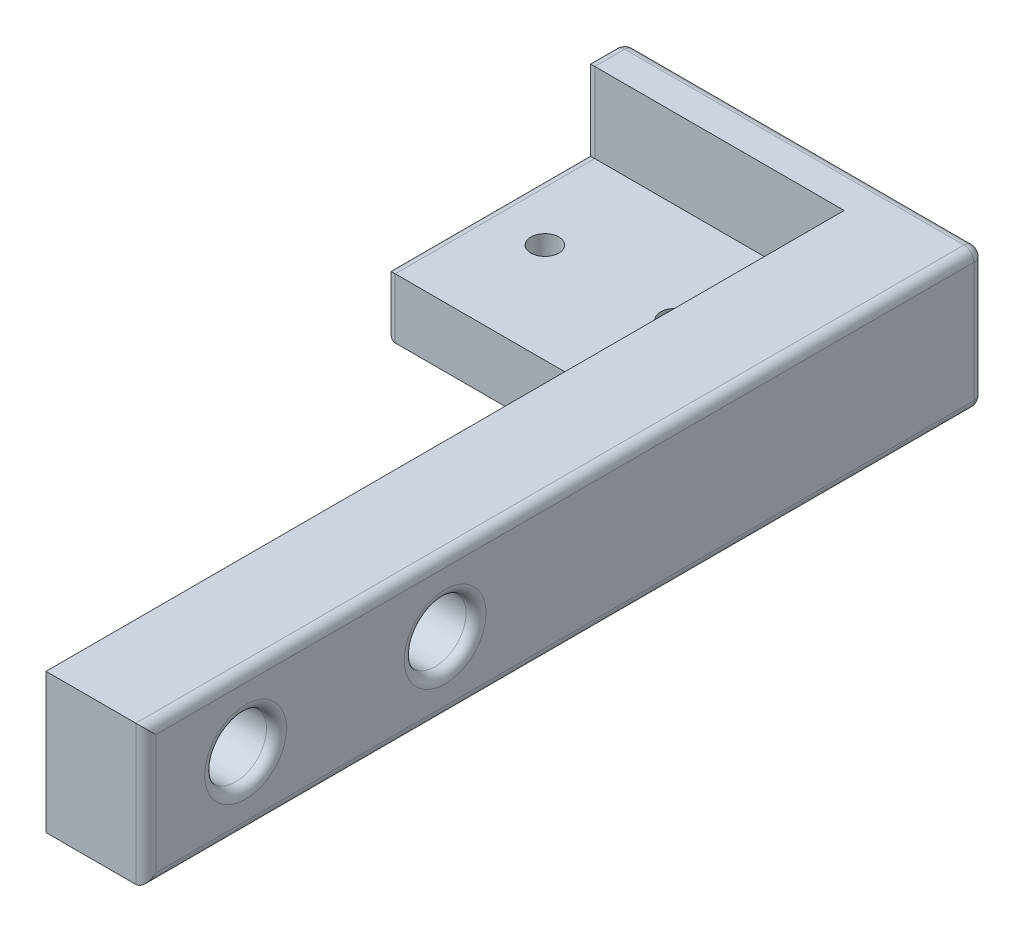
ISO-10303-21;
HEADER;
FILE_DESCRIPTION(('STEP AP214'),'2;1');
FILE_NAME('part.step','',(''),(''),'','','');
FILE_SCHEMA(('AUTOMOTIVE_DESIGN { 1 0 10303 214 1 1 1 1 }'));
ENDSEC;
DATA;
#1=APPLICATION_CONTEXT('core data for automotive mechanical design processes');
#2=APPLICATION_PROTOCOL_DEFINITION('international standard','automotive_design',2000,#1);
#3=PRODUCT_CONTEXT('',#1,'mechanical');
#4=PRODUCT('Part','Part','',(#3));
#5=PRODUCT_RELATED_PRODUCT_CATEGORY('part','',(#4));
#6=PRODUCT_DEFINITION_FORMATION('','',#4);
#7=PRODUCT_DEFINITION_CONTEXT('part definition',#1,'design');
#8=PRODUCT_DEFINITION('design','',#6,#7);
#9=PRODUCT_DEFINITION_SHAPE('','',#8);
#10=(LENGTH_UNIT() NAMED_UNIT(*) SI_UNIT(.MILLI.,.METRE.));
#11=(NAMED_UNIT(*) PLANE_ANGLE_UNIT() SI_UNIT($,.RADIAN.));
#12=(NAMED_UNIT(*) SI_UNIT($,.STERADIAN.) SOLID_ANGLE_UNIT());
#13=UNCERTAINTY_MEASURE_WITH_UNIT(LENGTH_MEASURE(1.E-05),#10,'distance_accuracy_value','');
#14=(GEOMETRIC_REPRESENTATION_CONTEXT(3) GLOBAL_UNCERTAINTY_ASSIGNED_CONTEXT((#13)) GLOBAL_UNIT_ASSIGNED_CONTEXT((#10,
#11,#12)) REPRESENTATION_CONTEXT('',''));
#15=CARTESIAN_POINT('',(0.,0.,0.));
#16=DIRECTION('',(0.,0.,1.));
#17=DIRECTION('',(1.,0.,0.));
#18=AXIS2_PLACEMENT_3D('',#15,#16,#17);
#19=CARTESIAN_POINT('',(0.,7.,0.));
#20=DIRECTION('',(0.,1.,0.));
#21=DIRECTION('',(0.,0.,1.));
#22=AXIS2_PLACEMENT_3D('',#19,#20,#21);
#23=PLANE('',#22);
#24=DIRECTION('',(1.,0.,0.));
#25=VECTOR('',#24,1.);
#26=CARTESIAN_POINT('',(0.,7.,-26.5));
#27=LINE('',#26,#25);
#28=CARTESIAN_POINT('',(2.,7.,-26.5));
#29=VERTEX_POINT('',#28);
#30=CARTESIAN_POINT('',(-15.,7.,-26.5));
#31=VERTEX_POINT('',#30);
#32=EDGE_CURVE('E259',#29,#31,#27,.F.);
#33=ORIENTED_EDGE('',*,*,#32,.T.);
#34=DIRECTION('',(0.,0.,-1.));
#35=VECTOR('',#34,1.);
#36=CARTESIAN_POINT('',(-15.,7.,-25.));
#37=LINE('',#36,#35);
#38=CARTESIAN_POINT('',(-15.,7.,-25.));
#39=VERTEX_POINT('',#38);
#40=EDGE_CURVE('E11',#31,#39,#37,.F.);
#41=ORIENTED_EDGE('',*,*,#40,.T.);
#42=DIRECTION('',(-1.,0.,0.));
#43=VECTOR('',#42,1.);
#44=CARTESIAN_POINT('',(-15.5,7.,-25.));
#45=LINE('',#44,#43);
#46=CARTESIAN_POINT('',(-2.5,7.,-25.));
#47=VERTEX_POINT('',#46);
#48=EDGE_CURVE('E170',#47,#39,#45,.T.);
#49=ORIENTED_EDGE('',*,*,#48,.F.);
#50=DIRECTION('',(0.,0.,1.));
#51=VECTOR('',#50,1.);
#52=CARTESIAN_POINT('',(-2.5,7.,-15.));
#53=LINE('',#52,#51);
#54=CARTESIAN_POINT('',(-2.5,7.,15.));
#55=VERTEX_POINT('',#54);
#56=EDGE_CURVE('E150',#47,#55,#53,.T.);
#57=ORIENTED_EDGE('',*,*,#56,.T.);
#58=DIRECTION('',(1.,0.,0.));
#59=VECTOR('',#58,1.);
#60=CARTESIAN_POINT('',(-2.5,7.,15.));
#61=LINE('',#60,#59);
#62=CARTESIAN_POINT('',(2.,7.,15.));
#63=VERTEX_POINT('',#62);
#64=EDGE_CURVE('E163',#55,#63,#61,.T.);
#65=ORIENTED_EDGE('',*,*,#64,.T.);
#66=DIRECTION('',(0.,0.,-1.));
#67=VECTOR('',#66,1.);
#68=CARTESIAN_POINT('',(2.,7.,-27.));
#69=LINE('',#68,#67);
#70=EDGE_CURVE('E262',#63,#29,#69,.T.);
#71=ORIENTED_EDGE('',*,*,#70,.T.);
#72=EDGE_LOOP('',(#33,#41,#49,#57,#65,#71));
#73=FACE_BOUND('',#72,.T.);
#74=ADVANCED_FACE('F41',(#73),#23,.T.);
#75=CARTESIAN_POINT('',(0.,0.,0.));
#76=DIRECTION('',(0.,1.,0.));
#77=DIRECTION('',(0.,0.,1.));
#78=AXIS2_PLACEMENT_3D('',#75,#76,#77);
#79=PLANE('',#78);
#80=DIRECTION('',(1.,0.,0.));
#81=VECTOR('',#80,1.);
#82=CARTESIAN_POINT('',(-2.5,0.,-15.));
#83=LINE('',#82,#81);
#84=CARTESIAN_POINT('',(-15.,0.,-15.));
#85=VERTEX_POINT('',#84);
#86=CARTESIAN_POINT('',(-2.5,0.,-15.));
#87=VERTEX_POINT('',#86);
#88=EDGE_CURVE('E207',#85,#87,#83,.T.);
#89=ORIENTED_EDGE('',*,*,#88,.F.);
#90=DIRECTION('',(0.,0.,1.));
#91=VECTOR('',#90,1.);
#92=CARTESIAN_POINT('',(-15.,0.,0.));
#93=LINE('',#92,#91);
#94=CARTESIAN_POINT('',(-15.,0.,-26.5));
#95=VERTEX_POINT('',#94);
#96=EDGE_CURVE('E51',#85,#95,#93,.F.);
#97=ORIENTED_EDGE('',*,*,#96,.T.);
#98=DIRECTION('',(1.,0.,0.));
#99=VECTOR('',#98,1.);
#100=CARTESIAN_POINT('',(2.5,0.,-26.5));
#101=LINE('',#100,#99);
#102=CARTESIAN_POINT('',(2.,0.,-26.5));
#103=VERTEX_POINT('',#102);
#104=EDGE_CURVE('E265',#95,#103,#101,.T.);
#105=ORIENTED_EDGE('',*,*,#104,.T.);
#106=DIRECTION('',(0.,0.,-1.));
#107=VECTOR('',#106,1.);
#108=CARTESIAN_POINT('',(2.,0.,0.));
#109=LINE('',#108,#107);
#110=CARTESIAN_POINT('',(2.,0.,15.));
#111=VERTEX_POINT('',#110);
#112=EDGE_CURVE('E268',#103,#111,#109,.F.);
#113=ORIENTED_EDGE('',*,*,#112,.T.);
#114=DIRECTION('',(1.,0.,0.));
#115=VECTOR('',#114,1.);
#116=CARTESIAN_POINT('',(-2.5,0.,15.));
#117=LINE('',#116,#115);
#118=CARTESIAN_POINT('',(-2.5,0.,15.));
#119=VERTEX_POINT('',#118);
#120=EDGE_CURVE('E164',#119,#111,#117,.T.);
#121=ORIENTED_EDGE('',*,*,#120,.F.);
#122=DIRECTION('',(0.,0.,1.));
#123=VECTOR('',#122,1.);
#124=CARTESIAN_POINT('',(-2.5,0.,-15.));
#125=LINE('',#124,#123);
#126=EDGE_CURVE('E213',#87,#119,#125,.T.);
#127=ORIENTED_EDGE('',*,*,#126,.F.);
#128=EDGE_LOOP('',(#89,#97,#105,#113,#121,#127));
#129=FACE_BOUND('',#128,.T.);
#130=CARTESIAN_POINT('',(-12.5,0.,-20.));
#131=DIRECTION('',(0.,1.,0.));
#132=DIRECTION('',(0.,0.,1.));
#133=AXIS2_PLACEMENT_3D('',#130,#131,#132);
#134=CIRCLE('',#133,0.699999999999999);
#135=CARTESIAN_POINT('',(-12.5,0.,-19.3));
#136=VERTEX_POINT('',#135);
#137=EDGE_CURVE('E203',#136,#136,#134,.T.);
#138=ORIENTED_EDGE('',*,*,#137,.T.);
#139=EDGE_LOOP('',(#138));
#140=FACE_BOUND('',#139,.T.);
#141=CARTESIAN_POINT('',(-6.,0.,-20.));
#142=DIRECTION('',(0.,1.,0.));
#143=DIRECTION('',(0.,0.,1.));
#144=AXIS2_PLACEMENT_3D('',#141,#142,#143);
#145=CIRCLE('',#144,0.7);
#146=CARTESIAN_POINT('',(-6.,0.,-19.3));
#147=VERTEX_POINT('',#146);
#148=EDGE_CURVE('E199',#147,#147,#145,.T.);
#149=ORIENTED_EDGE('',*,*,#148,.T.);
#150=EDGE_LOOP('',(#149));
#151=FACE_BOUND('',#150,.T.);
#152=ADVANCED_FACE('F442',(#129,#140,#151),#79,.F.);
#153=CARTESIAN_POINT('',(2.5,7.,-15.));
#154=DIRECTION('',(-1.,0.,0.));
#155=DIRECTION('',(0.,0.,1.));
#156=AXIS2_PLACEMENT_3D('',#153,#154,#155);
#157=PLANE('',#156);
#158=CARTESIAN_POINT('',(2.5,3.5,0.));
#159=DIRECTION('',(-1.,0.,0.));
#160=DIRECTION('',(0.,0.,1.));
#161=AXIS2_PLACEMENT_3D('',#158,#159,#160);
#162=CIRCLE('',#161,2.05);
#163=CARTESIAN_POINT('',(2.5,3.5,2.05));
#164=VERTEX_POINT('',#163);
#165=EDGE_CURVE('E251',#164,#164,#162,.T.);
#166=ORIENTED_EDGE('',*,*,#165,.T.);
#167=EDGE_LOOP('',(#166));
#168=FACE_BOUND('',#167,.T.);
#169=CARTESIAN_POINT('',(2.5,3.5,9.99999999999999));
#170=DIRECTION('',(-1.,0.,0.));
#171=DIRECTION('',(0.,0.,1.));
#172=AXIS2_PLACEMENT_3D('',#169,#170,#171);
#173=CIRCLE('',#172,2.05);
#174=CARTESIAN_POINT('',(2.5,3.5,12.05));
#175=VERTEX_POINT('',#174);
#176=EDGE_CURVE('E247',#175,#175,#173,.T.);
#177=ORIENTED_EDGE('',*,*,#176,.T.);
#178=EDGE_LOOP('',(#177));
#179=FACE_BOUND('',#178,.T.);
#180=DIRECTION('',(0.,0.,-1.));
#181=VECTOR('',#180,1.);
#182=CARTESIAN_POINT('',(2.5,6.5,15.));
#183=LINE('',#182,#181);
#184=CARTESIAN_POINT('',(2.5,6.5,-26.5));
#185=VERTEX_POINT('',#184);
#186=CARTESIAN_POINT('',(2.5,6.5,14.5));
#187=VERTEX_POINT('',#186);
#188=EDGE_CURVE('E240',#185,#187,#183,.F.);
#189=ORIENTED_EDGE('',*,*,#188,.T.);
#190=DIRECTION('',(0.,-1.,0.));
#191=VECTOR('',#190,1.);
#192=CARTESIAN_POINT('',(2.5,7.,14.5));
#193=LINE('',#192,#191);
#194=CARTESIAN_POINT('',(2.5,0.5,14.5));
#195=VERTEX_POINT('',#194);
#196=EDGE_CURVE('E243',#187,#195,#193,.T.);
#197=ORIENTED_EDGE('',*,*,#196,.T.);
#198=DIRECTION('',(0.,0.,-1.));
#199=VECTOR('',#198,1.);
#200=CARTESIAN_POINT('',(2.5,0.5,-15.));
#201=LINE('',#200,#199);
#202=CARTESIAN_POINT('',(2.5,0.5,-26.5));
#203=VERTEX_POINT('',#202);
#204=EDGE_CURVE('E237',#195,#203,#201,.T.);
#205=ORIENTED_EDGE('',*,*,#204,.T.);
#206=DIRECTION('',(0.,-1.,0.));
#207=VECTOR('',#206,1.);
#208=CARTESIAN_POINT('',(2.5,7.,-26.5));
#209=LINE('',#208,#207);
#210=EDGE_CURVE('E225',#203,#185,#209,.F.);
#211=ORIENTED_EDGE('',*,*,#210,.T.);
#212=EDGE_LOOP('',(#189,#197,#205,#211));
#213=FACE_BOUND('',#212,.T.);
#214=ADVANCED_FACE('F454',(#168,#179,#213),#157,.F.);
#215=CARTESIAN_POINT('',(-15.5,7.,-15.));
#216=DIRECTION('',(1.,0.,0.));
#217=DIRECTION('',(0.,0.,-1.));
#218=AXIS2_PLACEMENT_3D('',#215,#216,#217);
#219=PLANE('',#218);
#220=DIRECTION('',(0.,-1.,0.));
#221=VECTOR('',#220,1.);
#222=CARTESIAN_POINT('',(-15.5,0.,-26.5));
#223=LINE('',#222,#221);
#224=CARTESIAN_POINT('',(-15.5,6.5,-26.5));
#225=VERTEX_POINT('',#224);
#226=CARTESIAN_POINT('',(-15.5,0.5,-26.5));
#227=VERTEX_POINT('',#226);
#228=EDGE_CURVE('E294',#225,#227,#223,.T.);
#229=ORIENTED_EDGE('',*,*,#228,.T.);
#230=DIRECTION('',(0.,0.,1.));
#231=VECTOR('',#230,1.);
#232=CARTESIAN_POINT('',(-15.5,0.5,-15.));
#233=LINE('',#232,#231);
#234=CARTESIAN_POINT('',(-15.5,0.5,-15.5));
#235=VERTEX_POINT('',#234);
#236=EDGE_CURVE('E350',#227,#235,#233,.T.);
#237=ORIENTED_EDGE('',*,*,#236,.T.);
#238=DIRECTION('',(0.,-1.,0.));
#239=VECTOR('',#238,1.);
#240=CARTESIAN_POINT('',(-15.5,7.,-15.5));
#241=LINE('',#240,#239);
#242=CARTESIAN_POINT('',(-15.5,2.5,-15.5));
#243=VERTEX_POINT('',#242);
#244=EDGE_CURVE('E347',#235,#243,#241,.F.);
#245=ORIENTED_EDGE('',*,*,#244,.T.);
#246=DIRECTION('',(0.,0.,1.));
#247=VECTOR('',#246,1.);
#248=CARTESIAN_POINT('',(-15.5,2.5,-15.));
#249=LINE('',#248,#247);
#250=CARTESIAN_POINT('',(-15.5,2.5,-25.5));
#251=VERTEX_POINT('',#250);
#252=EDGE_CURVE('E344',#243,#251,#249,.F.);
#253=ORIENTED_EDGE('',*,*,#252,.T.);
#254=DIRECTION('',(0.,-1.,0.));
#255=VECTOR('',#254,1.);
#256=CARTESIAN_POINT('',(-15.5,7.,-25.5));
#257=LINE('',#256,#255);
#258=CARTESIAN_POINT('',(-15.5,6.5,-25.5));
#259=VERTEX_POINT('',#258);
#260=EDGE_CURVE('E341',#251,#259,#257,.F.);
#261=ORIENTED_EDGE('',*,*,#260,.T.);
#262=DIRECTION('',(0.,0.,-1.));
#263=VECTOR('',#262,1.);
#264=CARTESIAN_POINT('',(-15.5,6.5,-26.5));
#265=LINE('',#264,#263);
#266=EDGE_CURVE('E338',#259,#225,#265,.T.);
#267=ORIENTED_EDGE('',*,*,#266,.T.);
#268=EDGE_LOOP('',(#229,#237,#245,#253,#261,#267));
#269=FACE_BOUND('',#268,.T.);
#270=ADVANCED_FACE('F423',(#269),#219,.F.);
#271=CARTESIAN_POINT('',(-2.5,7.,-15.));
#272=DIRECTION('',(0.,0.,-1.));
#273=DIRECTION('',(-1.,0.,0.));
#274=AXIS2_PLACEMENT_3D('',#271,#272,#273);
#275=PLANE('',#274);
#276=DIRECTION('',(1.,0.,0.));
#277=VECTOR('',#276,1.);
#278=CARTESIAN_POINT('',(-15.5,3.,-15.));
#279=LINE('',#278,#277);
#280=CARTESIAN_POINT('',(-15.,3.,-15.));
#281=VERTEX_POINT('',#280);
#282=CARTESIAN_POINT('',(-2.5,3.,-15.));
#283=VERTEX_POINT('',#282);
#284=EDGE_CURVE('E179',#281,#283,#279,.T.);
#285=ORIENTED_EDGE('',*,*,#284,.F.);
#286=DIRECTION('',(0.,-1.,0.));
#287=VECTOR('',#286,1.);
#288=CARTESIAN_POINT('',(-15.,7.,-15.));
#289=LINE('',#288,#287);
#290=EDGE_CURVE('E59',#281,#85,#289,.T.);
#291=ORIENTED_EDGE('',*,*,#290,.T.);
#292=ORIENTED_EDGE('',*,*,#88,.T.);
#293=DIRECTION('',(0.,-1.,0.));
#294=VECTOR('',#293,1.);
#295=CARTESIAN_POINT('',(-2.5,7.,-15.));
#296=LINE('',#295,#294);
#297=EDGE_CURVE('E221',#283,#87,#296,.T.);
#298=ORIENTED_EDGE('',*,*,#297,.F.);
#299=EDGE_LOOP('',(#285,#291,#292,#298));
#300=FACE_BOUND('',#299,.T.);
#301=ADVANCED_FACE('F440',(#300),#275,.F.);
#302=CARTESIAN_POINT('',(-2.5,7.,-15.));
#303=DIRECTION('',(1.,0.,0.));
#304=DIRECTION('',(0.,0.,-1.));
#305=AXIS2_PLACEMENT_3D('',#302,#303,#304);
#306=PLANE('',#305);
#307=CARTESIAN_POINT('',(-2.5,3.5,9.99999999999999));
#308=DIRECTION('',(1.,0.,0.));
#309=DIRECTION('',(0.,0.,-1.));
#310=AXIS2_PLACEMENT_3D('',#307,#308,#309);
#311=CIRCLE('',#310,1.55);
#312=CARTESIAN_POINT('',(-2.5,3.5,8.45));
#313=VERTEX_POINT('',#312);
#314=EDGE_CURVE('E204',#313,#313,#311,.T.);
#315=ORIENTED_EDGE('',*,*,#314,.T.);
#316=EDGE_LOOP('',(#315));
#317=FACE_BOUND('',#316,.T.);
#318=CARTESIAN_POINT('',(-2.5,3.5,0.));
#319=DIRECTION('',(1.,0.,0.));
#320=DIRECTION('',(0.,0.,-1.));
#321=AXIS2_PLACEMENT_3D('',#318,#319,#320);
#322=CIRCLE('',#321,1.55);
#323=CARTESIAN_POINT('',(-2.5,3.5,-1.55));
#324=VERTEX_POINT('',#323);
#325=EDGE_CURVE('E198',#324,#324,#322,.T.);
#326=ORIENTED_EDGE('',*,*,#325,.T.);
#327=EDGE_LOOP('',(#326));
#328=FACE_BOUND('',#327,.T.);
#329=ORIENTED_EDGE('',*,*,#126,.T.);
#330=DIRECTION('',(0.,-1.,0.));
#331=VECTOR('',#330,1.);
#332=CARTESIAN_POINT('',(-2.5,7.,15.));
#333=LINE('',#332,#331);
#334=EDGE_CURVE('E157',#55,#119,#333,.T.);
#335=ORIENTED_EDGE('',*,*,#334,.F.);
#336=ORIENTED_EDGE('',*,*,#56,.F.);
#337=DIRECTION('',(0.,1.,0.));
#338=VECTOR('',#337,1.);
#339=CARTESIAN_POINT('',(-2.5,3.,-25.));
#340=LINE('',#339,#338);
#341=CARTESIAN_POINT('',(-2.5,3.,-25.));
#342=VERTEX_POINT('',#341);
#343=EDGE_CURVE('E154',#342,#47,#340,.T.);
#344=ORIENTED_EDGE('',*,*,#343,.F.);
#345=DIRECTION('',(0.,0.,-1.));
#346=VECTOR('',#345,1.);
#347=CARTESIAN_POINT('',(-2.5,3.,-15.));
#348=LINE('',#347,#346);
#349=EDGE_CURVE('E184',#283,#342,#348,.T.);
#350=ORIENTED_EDGE('',*,*,#349,.F.);
#351=ORIENTED_EDGE('',*,*,#297,.T.);
#352=EDGE_LOOP('',(#329,#335,#336,#344,#350,#351));
#353=FACE_BOUND('',#352,.T.);
#354=ADVANCED_FACE('F152',(#317,#328,#353),#306,.F.);
#355=CARTESIAN_POINT('',(-2.5,7.,15.));
#356=DIRECTION('',(0.,0.,-1.));
#357=DIRECTION('',(-1.,0.,0.));
#358=AXIS2_PLACEMENT_3D('',#355,#356,#357);
#359=PLANE('',#358);
#360=ORIENTED_EDGE('',*,*,#120,.T.);
#361=DIRECTION('',(0.,-1.,0.));
#362=VECTOR('',#361,1.);
#363=CARTESIAN_POINT('',(2.,7.,15.));
#364=LINE('',#363,#362);
#365=EDGE_CURVE('E255',#111,#63,#364,.F.);
#366=ORIENTED_EDGE('',*,*,#365,.T.);
#367=ORIENTED_EDGE('',*,*,#64,.F.);
#368=ORIENTED_EDGE('',*,*,#334,.T.);
#369=EDGE_LOOP('',(#360,#366,#367,#368));
#370=FACE_BOUND('',#369,.T.);
#371=ADVANCED_FACE('F446',(#370),#359,.F.);
#372=CARTESIAN_POINT('',(-12.5,7.,-20.));
#373=DIRECTION('',(0.,-1.,0.));
#374=DIRECTION('',(0.,0.,-1.));
#375=AXIS2_PLACEMENT_3D('',#372,#373,#374);
#376=CYLINDRICAL_SURFACE('',#375,0.699999999999999);
#377=CARTESIAN_POINT('',(-12.5,3.,-20.));
#378=DIRECTION('',(0.,-1.,0.));
#379=DIRECTION('',(0.,0.,-1.));
#380=AXIS2_PLACEMENT_3D('',#377,#378,#379);
#381=CIRCLE('',#380,0.699999999999999);
#382=CARTESIAN_POINT('',(-12.5,3.,-20.7));
#383=VERTEX_POINT('',#382);
#384=EDGE_CURVE('E194',#383,#383,#381,.T.);
#385=ORIENTED_EDGE('',*,*,#384,.F.);
#386=EDGE_LOOP('',(#385));
#387=FACE_BOUND('',#386,.T.);
#388=ORIENTED_EDGE('',*,*,#137,.F.);
#389=EDGE_LOOP('',(#388));
#390=FACE_BOUND('',#389,.T.);
#391=ADVANCED_FACE('F476',(#387,#390),#376,.F.);
#392=CARTESIAN_POINT('',(-6.,7.,-20.));
#393=DIRECTION('',(0.,-1.,0.));
#394=DIRECTION('',(0.,0.,-1.));
#395=AXIS2_PLACEMENT_3D('',#392,#393,#394);
#396=CYLINDRICAL_SURFACE('',#395,0.7);
#397=CARTESIAN_POINT('',(-6.,3.,-20.));
#398=DIRECTION('',(0.,-1.,0.));
#399=DIRECTION('',(0.,0.,-1.));
#400=AXIS2_PLACEMENT_3D('',#397,#398,#399);
#401=CIRCLE('',#400,0.7);
#402=CARTESIAN_POINT('',(-6.,3.,-20.7));
#403=VERTEX_POINT('',#402);
#404=EDGE_CURVE('E174',#403,#403,#401,.T.);
#405=ORIENTED_EDGE('',*,*,#404,.F.);
#406=EDGE_LOOP('',(#405));
#407=FACE_BOUND('',#406,.T.);
#408=ORIENTED_EDGE('',*,*,#148,.F.);
#409=EDGE_LOOP('',(#408));
#410=FACE_BOUND('',#409,.T.);
#411=ADVANCED_FACE('F712',(#407,#410),#396,.F.);
#412=CARTESIAN_POINT('',(-15.5,3.5,0.));
#413=DIRECTION('',(1.,0.,0.));
#414=DIRECTION('',(0.,0.,-1.));
#415=AXIS2_PLACEMENT_3D('',#412,#413,#414);
#416=CYLINDRICAL_SURFACE('',#415,1.55);
#417=CARTESIAN_POINT('',(2.,3.5,0.));
#418=DIRECTION('',(-1.,0.,0.));
#419=DIRECTION('',(0.,0.,1.));
#420=AXIS2_PLACEMENT_3D('',#417,#418,#419);
#421=CIRCLE('',#420,1.55);
#422=CARTESIAN_POINT('',(2.,3.5,1.55));
#423=VERTEX_POINT('',#422);
#424=EDGE_CURVE('E271',#423,#423,#421,.F.);
#425=ORIENTED_EDGE('',*,*,#424,.T.);
#426=EDGE_LOOP('',(#425));
#427=FACE_BOUND('',#426,.T.);
#428=ORIENTED_EDGE('',*,*,#325,.F.);
#429=EDGE_LOOP('',(#428));
#430=FACE_BOUND('',#429,.T.);
#431=ADVANCED_FACE('F703',(#427,#430),#416,.F.);
#432=CARTESIAN_POINT('',(-15.5,3.5,9.99999999999999));
#433=DIRECTION('',(1.,0.,0.));
#434=DIRECTION('',(0.,0.,-1.));
#435=AXIS2_PLACEMENT_3D('',#432,#433,#434);
#436=CYLINDRICAL_SURFACE('',#435,1.55);
#437=CARTESIAN_POINT('',(2.,3.5,9.99999999999999));
#438=DIRECTION('',(-1.,0.,0.));
#439=DIRECTION('',(0.,0.,1.));
#440=AXIS2_PLACEMENT_3D('',#437,#438,#439);
#441=CIRCLE('',#440,1.55);
#442=CARTESIAN_POINT('',(2.,3.5,11.55));
#443=VERTEX_POINT('',#442);
#444=EDGE_CURVE('E275',#443,#443,#441,.F.);
#445=ORIENTED_EDGE('',*,*,#444,.T.);
#446=EDGE_LOOP('',(#445));
#447=FACE_BOUND('',#446,.T.);
#448=ORIENTED_EDGE('',*,*,#314,.F.);
#449=EDGE_LOOP('',(#448));
#450=FACE_BOUND('',#449,.T.);
#451=ADVANCED_FACE('F686',(#447,#450),#436,.F.);
#452=CARTESIAN_POINT('',(0.,3.,0.));
#453=DIRECTION('',(0.,-1.,0.));
#454=DIRECTION('',(0.,0.,-1.));
#455=AXIS2_PLACEMENT_3D('',#452,#453,#454);
#456=PLANE('',#455);
#457=ORIENTED_EDGE('',*,*,#384,.T.);
#458=EDGE_LOOP('',(#457));
#459=FACE_BOUND('',#458,.T.);
#460=ORIENTED_EDGE('',*,*,#404,.T.);
#461=EDGE_LOOP('',(#460));
#462=FACE_BOUND('',#461,.T.);
#463=DIRECTION('',(-1.,0.,0.));
#464=VECTOR('',#463,1.);
#465=CARTESIAN_POINT('',(-15.5,3.,-25.));
#466=LINE('',#465,#464);
#467=CARTESIAN_POINT('',(-15.,3.,-25.));
#468=VERTEX_POINT('',#467);
#469=EDGE_CURVE('E172',#342,#468,#466,.T.);
#470=ORIENTED_EDGE('',*,*,#469,.T.);
#471=DIRECTION('',(0.,0.,1.));
#472=VECTOR('',#471,1.);
#473=CARTESIAN_POINT('',(-15.,3.,0.));
#474=LINE('',#473,#472);
#475=EDGE_CURVE('E67',#468,#281,#474,.T.);
#476=ORIENTED_EDGE('',*,*,#475,.T.);
#477=ORIENTED_EDGE('',*,*,#284,.T.);
#478=ORIENTED_EDGE('',*,*,#349,.T.);
#479=EDGE_LOOP('',(#470,#476,#477,#478));
#480=FACE_BOUND('',#479,.T.);
#481=ADVANCED_FACE('F437',(#459,#462,#480),#456,.F.);
#482=CARTESIAN_POINT('',(-15.5,7.,-25.));
#483=DIRECTION('',(0.,0.,1.));
#484=DIRECTION('',(1.,0.,0.));
#485=AXIS2_PLACEMENT_3D('',#482,#483,#484);
#486=PLANE('',#485);
#487=ORIENTED_EDGE('',*,*,#48,.T.);
#488=DIRECTION('',(0.,-1.,0.));
#489=VECTOR('',#488,1.);
#490=CARTESIAN_POINT('',(-15.,3.,-25.));
#491=LINE('',#490,#489);
#492=EDGE_CURVE('E335',#39,#468,#491,.T.);
#493=ORIENTED_EDGE('',*,*,#492,.T.);
#494=ORIENTED_EDGE('',*,*,#469,.F.);
#495=ORIENTED_EDGE('',*,*,#343,.T.);
#496=EDGE_LOOP('',(#487,#493,#494,#495));
#497=FACE_BOUND('',#496,.T.);
#498=ADVANCED_FACE('F169',(#497),#486,.T.);
#499=CARTESIAN_POINT('',(-15.5,7.,-27.));
#500=DIRECTION('',(0.,0.,-1.));
#501=DIRECTION('',(-1.,0.,0.));
#502=AXIS2_PLACEMENT_3D('',#499,#500,#501);
#503=PLANE('',#502);
#504=DIRECTION('',(1.,0.,0.));
#505=VECTOR('',#504,1.);
#506=CARTESIAN_POINT('',(-15.5,6.5,-27.));
#507=LINE('',#506,#505);
#508=CARTESIAN_POINT('',(-15.,6.5,-27.));
#509=VERTEX_POINT('',#508);
#510=CARTESIAN_POINT('',(2.,6.5,-27.));
#511=VERTEX_POINT('',#510);
#512=EDGE_CURVE('E287',#509,#511,#507,.T.);
#513=ORIENTED_EDGE('',*,*,#512,.T.);
#514=DIRECTION('',(0.,-1.,0.));
#515=VECTOR('',#514,1.);
#516=CARTESIAN_POINT('',(2.,0.,-27.));
#517=LINE('',#516,#515);
#518=CARTESIAN_POINT('',(2.,0.5,-27.));
#519=VERTEX_POINT('',#518);
#520=EDGE_CURVE('E290',#511,#519,#517,.T.);
#521=ORIENTED_EDGE('',*,*,#520,.T.);
#522=DIRECTION('',(1.,0.,0.));
#523=VECTOR('',#522,1.);
#524=CARTESIAN_POINT('',(-15.5,0.5,-27.));
#525=LINE('',#524,#523);
#526=CARTESIAN_POINT('',(-15.,0.5,-27.));
#527=VERTEX_POINT('',#526);
#528=EDGE_CURVE('E279',#519,#527,#525,.F.);
#529=ORIENTED_EDGE('',*,*,#528,.T.);
#530=DIRECTION('',(0.,-1.,0.));
#531=VECTOR('',#530,1.);
#532=CARTESIAN_POINT('',(-15.,7.,-27.));
#533=LINE('',#532,#531);
#534=EDGE_CURVE('E283',#527,#509,#533,.F.);
#535=ORIENTED_EDGE('',*,*,#534,.T.);
#536=EDGE_LOOP('',(#513,#521,#529,#535));
#537=FACE_BOUND('',#536,.T.);
#538=ADVANCED_FACE('F395',(#537),#503,.T.);
#539=CARTESIAN_POINT('',(-15.,7.,-26.5));
#540=DIRECTION('',(0.,1.,0.));
#541=DIRECTION('',(0.,0.,1.));
#542=AXIS2_PLACEMENT_3D('',#539,#540,#541);
#543=CYLINDRICAL_SURFACE('',#542,0.5);
#544=ORIENTED_EDGE('',*,*,#534,.F.);
#545=CARTESIAN_POINT('',(-15.,0.5,-26.5));
#546=DIRECTION('',(0.,1.,0.));
#547=DIRECTION('',(0.,0.,1.));
#548=AXIS2_PLACEMENT_3D('',#545,#546,#547);
#549=CIRCLE('',#548,0.5);
#550=EDGE_CURVE('E329',#527,#227,#549,.T.);
#551=ORIENTED_EDGE('',*,*,#550,.T.);
#552=ORIENTED_EDGE('',*,*,#228,.F.);
#553=CARTESIAN_POINT('',(-15.,6.5,-26.5));
#554=DIRECTION('',(0.,1.,0.));
#555=DIRECTION('',(0.,0.,1.));
#556=AXIS2_PLACEMENT_3D('',#553,#554,#555);
#557=CIRCLE('',#556,0.5);
#558=EDGE_CURVE('E326',#225,#509,#557,.F.);
#559=ORIENTED_EDGE('',*,*,#558,.T.);
#560=EDGE_LOOP('',(#544,#551,#552,#559));
#561=FACE_BOUND('',#560,.T.);
#562=ADVANCED_FACE('F392',(#561),#543,.T.);
#563=CARTESIAN_POINT('',(-15.5,6.5,-26.5));
#564=DIRECTION('',(1.,0.,0.));
#565=DIRECTION('',(0.,0.,-1.));
#566=AXIS2_PLACEMENT_3D('',#563,#564,#565);
#567=CYLINDRICAL_SURFACE('',#566,0.5);
#568=ORIENTED_EDGE('',*,*,#512,.F.);
#569=CARTESIAN_POINT('',(-15.,6.5,-26.5));
#570=DIRECTION('',(1.,0.,0.));
#571=DIRECTION('',(0.,0.,-1.));
#572=AXIS2_PLACEMENT_3D('',#569,#570,#571);
#573=CIRCLE('',#572,0.5);
#574=EDGE_CURVE('E332',#509,#31,#573,.T.);
#575=ORIENTED_EDGE('',*,*,#574,.T.);
#576=ORIENTED_EDGE('',*,*,#32,.F.);
#577=CARTESIAN_POINT('',(2.,6.5,-26.5));
#578=DIRECTION('',(1.,0.,0.));
#579=DIRECTION('',(0.,0.,-1.));
#580=AXIS2_PLACEMENT_3D('',#577,#578,#579);
#581=CIRCLE('',#580,0.5);
#582=EDGE_CURVE('E180',#511,#29,#581,.T.);
#583=ORIENTED_EDGE('',*,*,#582,.F.);
#584=EDGE_LOOP('',(#568,#575,#576,#583));
#585=FACE_BOUND('',#584,.T.);
#586=ADVANCED_FACE('F400',(#585),#567,.T.);
#587=CARTESIAN_POINT('',(2.,7.,-26.5));
#588=DIRECTION('',(0.,1.,0.));
#589=DIRECTION('',(0.,0.,1.));
#590=AXIS2_PLACEMENT_3D('',#587,#588,#589);
#591=CYLINDRICAL_SURFACE('',#590,0.5);
#592=CARTESIAN_POINT('',(2.,0.5,-26.5));
#593=DIRECTION('',(0.,-1.,0.));
#594=DIRECTION('',(1.,0.,0.));
#595=AXIS2_PLACEMENT_3D('',#592,#593,#594);
#596=CIRCLE('',#595,0.5);
#597=EDGE_CURVE('E316',#519,#203,#596,.T.);
#598=ORIENTED_EDGE('',*,*,#597,.F.);
#599=ORIENTED_EDGE('',*,*,#520,.F.);
#600=CARTESIAN_POINT('',(2.,6.5,-26.5));
#601=DIRECTION('',(0.,1.,0.));
#602=DIRECTION('',(0.,0.,1.));
#603=AXIS2_PLACEMENT_3D('',#600,#601,#602);
#604=CIRCLE('',#603,0.5);
#605=EDGE_CURVE('E187',#185,#511,#604,.T.);
#606=ORIENTED_EDGE('',*,*,#605,.F.);
#607=ORIENTED_EDGE('',*,*,#210,.F.);
#608=EDGE_LOOP('',(#598,#599,#606,#607));
#609=FACE_BOUND('',#608,.T.);
#610=ADVANCED_FACE('F410',(#609),#591,.T.);
#611=CARTESIAN_POINT('',(0.,0.5,-26.5));
#612=DIRECTION('',(-1.,0.,0.));
#613=DIRECTION('',(0.,0.,1.));
#614=AXIS2_PLACEMENT_3D('',#611,#612,#613);
#615=CYLINDRICAL_SURFACE('',#614,0.5);
#616=ORIENTED_EDGE('',*,*,#104,.F.);
#617=CARTESIAN_POINT('',(-15.,0.5,-26.5));
#618=DIRECTION('',(-1.,0.,0.));
#619=DIRECTION('',(0.,0.,1.));
#620=AXIS2_PLACEMENT_3D('',#617,#618,#619);
#621=CIRCLE('',#620,0.5);
#622=EDGE_CURVE('E298',#95,#527,#621,.F.);
#623=ORIENTED_EDGE('',*,*,#622,.T.);
#624=ORIENTED_EDGE('',*,*,#528,.F.);
#625=CARTESIAN_POINT('',(2.,0.5,-26.5));
#626=DIRECTION('',(1.,0.,0.));
#627=DIRECTION('',(0.,0.,-1.));
#628=AXIS2_PLACEMENT_3D('',#625,#626,#627);
#629=CIRCLE('',#628,0.5);
#630=EDGE_CURVE('E313',#103,#519,#629,.T.);
#631=ORIENTED_EDGE('',*,*,#630,.F.);
#632=EDGE_LOOP('',(#616,#623,#624,#631));
#633=FACE_BOUND('',#632,.T.);
#634=ADVANCED_FACE('F416',(#633),#615,.T.);
#635=CARTESIAN_POINT('',(2.,6.5,-26.5));
#636=DIRECTION('',(0.,0.,1.));
#637=DIRECTION('',(1.,0.,0.));
#638=AXIS2_PLACEMENT_3D('',#635,#636,#637);
#639=SPHERICAL_SURFACE('',#638,0.5);
#640=ORIENTED_EDGE('',*,*,#605,.T.);
#641=ORIENTED_EDGE('',*,*,#582,.T.);
#642=CARTESIAN_POINT('',(2.,6.5,-26.5));
#643=DIRECTION('',(0.,0.,-1.));
#644=DIRECTION('',(-1.,0.,0.));
#645=AXIS2_PLACEMENT_3D('',#642,#643,#644);
#646=CIRCLE('',#645,0.5);
#647=EDGE_CURVE('E309',#185,#29,#646,.F.);
#648=ORIENTED_EDGE('',*,*,#647,.F.);
#649=EDGE_LOOP('',(#640,#641,#648));
#650=FACE_BOUND('',#649,.T.);
#651=ADVANCED_FACE('F405',(#650),#639,.T.);
#652=CARTESIAN_POINT('',(2.,0.5,-26.5));
#653=DIRECTION('',(0.,0.,1.));
#654=DIRECTION('',(1.,0.,0.));
#655=AXIS2_PLACEMENT_3D('',#652,#653,#654);
#656=SPHERICAL_SURFACE('',#655,0.5);
#657=ORIENTED_EDGE('',*,*,#630,.T.);
#658=ORIENTED_EDGE('',*,*,#597,.T.);
#659=CARTESIAN_POINT('',(2.,0.5,-26.5));
#660=DIRECTION('',(0.,0.,-1.));
#661=DIRECTION('',(-1.,0.,0.));
#662=AXIS2_PLACEMENT_3D('',#659,#660,#661);
#663=CIRCLE('',#662,0.5);
#664=EDGE_CURVE('E305',#103,#203,#663,.F.);
#665=ORIENTED_EDGE('',*,*,#664,.F.);
#666=EDGE_LOOP('',(#657,#658,#665));
#667=FACE_BOUND('',#666,.T.);
#668=ADVANCED_FACE('F460',(#667),#656,.T.);
#669=CARTESIAN_POINT('',(2.,6.5,0.));
#670=DIRECTION('',(0.,0.,1.));
#671=DIRECTION('',(1.,0.,0.));
#672=AXIS2_PLACEMENT_3D('',#669,#670,#671);
#673=CYLINDRICAL_SURFACE('',#672,0.5);
#674=ORIENTED_EDGE('',*,*,#647,.T.);
#675=ORIENTED_EDGE('',*,*,#70,.F.);
#676=CARTESIAN_POINT('',(2.,6.5,14.5));
#677=DIRECTION('',(0.,-0.707106781186547,0.707106781186547));
#678=DIRECTION('',(0.,0.707106781186547,0.707106781186547));
#679=AXIS2_PLACEMENT_3D('',#676,#677,#678);
#680=ELLIPSE('',#679,0.707106781186547,0.5);
#681=EDGE_CURVE('E302',#187,#63,#680,.T.);
#682=ORIENTED_EDGE('',*,*,#681,.F.);
#683=ORIENTED_EDGE('',*,*,#188,.F.);
#684=EDGE_LOOP('',(#674,#675,#682,#683));
#685=FACE_BOUND('',#684,.T.);
#686=ADVANCED_FACE('F451',(#685),#673,.T.);
#687=CARTESIAN_POINT('',(2.,0.5,-15.));
#688=DIRECTION('',(0.,0.,-1.));
#689=DIRECTION('',(-1.,0.,0.));
#690=AXIS2_PLACEMENT_3D('',#687,#688,#689);
#691=CYLINDRICAL_SURFACE('',#690,0.5);
#692=ORIENTED_EDGE('',*,*,#664,.T.);
#693=ORIENTED_EDGE('',*,*,#204,.F.);
#694=CARTESIAN_POINT('',(2.,0.5,14.5));
#695=DIRECTION('',(0.,-0.707106781186547,-0.707106781186547));
#696=DIRECTION('',(0.,0.707106781186547,-0.707106781186547));
#697=AXIS2_PLACEMENT_3D('',#694,#695,#696);
#698=ELLIPSE('',#697,0.707106781186547,0.5);
#699=EDGE_CURVE('E299',#111,#195,#698,.F.);
#700=ORIENTED_EDGE('',*,*,#699,.F.);
#701=ORIENTED_EDGE('',*,*,#112,.F.);
#702=EDGE_LOOP('',(#692,#693,#700,#701));
#703=FACE_BOUND('',#702,.T.);
#704=ADVANCED_FACE('F458',(#703),#691,.T.);
#705=CARTESIAN_POINT('',(2.,7.,14.5));
#706=DIRECTION('',(0.,-1.,0.));
#707=DIRECTION('',(0.,0.,-1.));
#708=AXIS2_PLACEMENT_3D('',#705,#706,#707);
#709=CYLINDRICAL_SURFACE('',#708,0.5);
#710=ORIENTED_EDGE('',*,*,#681,.T.);
#711=ORIENTED_EDGE('',*,*,#365,.F.);
#712=ORIENTED_EDGE('',*,*,#699,.T.);
#713=ORIENTED_EDGE('',*,*,#196,.F.);
#714=EDGE_LOOP('',(#710,#711,#712,#713));
#715=FACE_BOUND('',#714,.T.);
#716=ADVANCED_FACE('F491',(#715),#709,.T.);
#717=CARTESIAN_POINT('',(2.,3.5,0.));
#718=DIRECTION('',(-1.,0.,0.));
#719=DIRECTION('',(0.,0.,1.));
#720=AXIS2_PLACEMENT_3D('',#717,#718,#719);
#721=TOROIDAL_SURFACE('',#720,2.05,0.5);
#722=ORIENTED_EDGE('',*,*,#165,.F.);
#723=EDGE_LOOP('',(#722));
#724=FACE_BOUND('',#723,.T.);
#725=ORIENTED_EDGE('',*,*,#424,.F.);
#726=EDGE_LOOP('',(#725));
#727=FACE_BOUND('',#726,.T.);
#728=ADVANCED_FACE('F494',(#724,#727),#721,.T.);
#729=CARTESIAN_POINT('',(2.,3.5,9.99999999999999));
#730=DIRECTION('',(-1.,0.,0.));
#731=DIRECTION('',(0.,0.,1.));
#732=AXIS2_PLACEMENT_3D('',#729,#730,#731);
#733=TOROIDAL_SURFACE('',#732,2.05,0.5);
#734=ORIENTED_EDGE('',*,*,#176,.F.);
#735=EDGE_LOOP('',(#734));
#736=FACE_BOUND('',#735,.T.);
#737=ORIENTED_EDGE('',*,*,#444,.F.);
#738=EDGE_LOOP('',(#737));
#739=FACE_BOUND('',#738,.T.);
#740=ADVANCED_FACE('F511',(#736,#739),#733,.T.);
#741=CARTESIAN_POINT('',(-15.,6.5,-26.5));
#742=DIRECTION('',(0.,0.,1.));
#743=DIRECTION('',(1.,0.,0.));
#744=AXIS2_PLACEMENT_3D('',#741,#742,#743);
#745=SPHERICAL_SURFACE('',#744,0.5);
#746=ORIENTED_EDGE('',*,*,#574,.F.);
#747=ORIENTED_EDGE('',*,*,#558,.F.);
#748=CARTESIAN_POINT('',(-15.,6.5,-26.5));
#749=DIRECTION('',(0.,0.,1.));
#750=DIRECTION('',(1.,0.,0.));
#751=AXIS2_PLACEMENT_3D('',#748,#749,#750);
#752=CIRCLE('',#751,0.5);
#753=EDGE_CURVE('E45',#31,#225,#752,.T.);
#754=ORIENTED_EDGE('',*,*,#753,.F.);
#755=EDGE_LOOP('',(#746,#747,#754));
#756=FACE_BOUND('',#755,.T.);
#757=ADVANCED_FACE('F43',(#756),#745,.T.);
#758=CARTESIAN_POINT('',(-15.,6.5,-15.));
#759=DIRECTION('',(0.,0.,1.));
#760=DIRECTION('',(1.,0.,0.));
#761=AXIS2_PLACEMENT_3D('',#758,#759,#760);
#762=CYLINDRICAL_SURFACE('',#761,0.5);
#763=ORIENTED_EDGE('',*,*,#753,.T.);
#764=ORIENTED_EDGE('',*,*,#266,.F.);
#765=CARTESIAN_POINT('',(-15.,6.5,-25.5));
#766=DIRECTION('',(0.,-0.707106781186547,0.707106781186547));
#767=DIRECTION('',(0.,0.707106781186547,0.707106781186547));
#768=AXIS2_PLACEMENT_3D('',#765,#766,#767);
#769=ELLIPSE('',#768,0.707106781186547,0.5);
#770=EDGE_CURVE('E374',#39,#259,#769,.T.);
#771=ORIENTED_EDGE('',*,*,#770,.F.);
#772=ORIENTED_EDGE('',*,*,#40,.F.);
#773=EDGE_LOOP('',(#763,#764,#771,#772));
#774=FACE_BOUND('',#773,.T.);
#775=ADVANCED_FACE('F385',(#774),#762,.T.);
#776=CARTESIAN_POINT('',(-15.,7.,-25.5));
#777=DIRECTION('',(0.,1.,0.));
#778=DIRECTION('',(0.,0.,1.));
#779=AXIS2_PLACEMENT_3D('',#776,#777,#778);
#780=CYLINDRICAL_SURFACE('',#779,0.5);
#781=ORIENTED_EDGE('',*,*,#770,.T.);
#782=ORIENTED_EDGE('',*,*,#260,.F.);
#783=CARTESIAN_POINT('',(-15.,2.5,-25.5));
#784=DIRECTION('',(0.,0.707106781186547,-0.707106781186547));
#785=DIRECTION('',(0.,0.707106781186547,0.707106781186547));
#786=AXIS2_PLACEMENT_3D('',#783,#784,#785);
#787=ELLIPSE('',#786,0.707106781186547,0.5);
#788=EDGE_CURVE('E371',#468,#251,#787,.F.);
#789=ORIENTED_EDGE('',*,*,#788,.F.);
#790=ORIENTED_EDGE('',*,*,#492,.F.);
#791=EDGE_LOOP('',(#781,#782,#789,#790));
#792=FACE_BOUND('',#791,.T.);
#793=ADVANCED_FACE('F436',(#792),#780,.T.);
#794=CARTESIAN_POINT('',(-15.,2.5,0.));
#795=DIRECTION('',(0.,0.,1.));
#796=DIRECTION('',(1.,0.,0.));
#797=AXIS2_PLACEMENT_3D('',#794,#795,#796);
#798=CYLINDRICAL_SURFACE('',#797,0.5);
#799=ORIENTED_EDGE('',*,*,#788,.T.);
#800=ORIENTED_EDGE('',*,*,#252,.F.);
#801=CARTESIAN_POINT('',(-15.,2.5,-15.5));
#802=DIRECTION('',(0.,-0.707106781186547,0.707106781186547));
#803=DIRECTION('',(0.,-0.707106781186547,-0.707106781186547));
#804=AXIS2_PLACEMENT_3D('',#801,#802,#803);
#805=ELLIPSE('',#804,0.707106781186547,0.5);
#806=EDGE_CURVE('E367',#281,#243,#805,.T.);
#807=ORIENTED_EDGE('',*,*,#806,.F.);
#808=ORIENTED_EDGE('',*,*,#475,.F.);
#809=EDGE_LOOP('',(#799,#800,#807,#808));
#810=FACE_BOUND('',#809,.T.);
#811=ADVANCED_FACE('F434',(#810),#798,.T.);
#812=CARTESIAN_POINT('',(-15.,7.,-15.5));
#813=DIRECTION('',(0.,-1.,0.));
#814=DIRECTION('',(0.,0.,-1.));
#815=AXIS2_PLACEMENT_3D('',#812,#813,#814);
#816=CYLINDRICAL_SURFACE('',#815,0.5);
#817=ORIENTED_EDGE('',*,*,#806,.T.);
#818=ORIENTED_EDGE('',*,*,#244,.F.);
#819=CARTESIAN_POINT('',(-15.,0.5,-15.5));
#820=DIRECTION('',(0.,0.707106781186547,0.707106781186547));
#821=DIRECTION('',(0.,-0.707106781186547,0.707106781186547));
#822=AXIS2_PLACEMENT_3D('',#819,#820,#821);
#823=ELLIPSE('',#822,0.707106781186547,0.5);
#824=EDGE_CURVE('E363',#85,#235,#823,.F.);
#825=ORIENTED_EDGE('',*,*,#824,.F.);
#826=ORIENTED_EDGE('',*,*,#290,.F.);
#827=EDGE_LOOP('',(#817,#818,#825,#826));
#828=FACE_BOUND('',#827,.T.);
#829=ADVANCED_FACE('F430',(#828),#816,.T.);
#830=CARTESIAN_POINT('',(-15.,0.5,-15.));
#831=DIRECTION('',(0.,0.,1.));
#832=DIRECTION('',(1.,0.,0.));
#833=AXIS2_PLACEMENT_3D('',#830,#831,#832);
#834=CYLINDRICAL_SURFACE('',#833,0.5);
#835=ORIENTED_EDGE('',*,*,#824,.T.);
#836=ORIENTED_EDGE('',*,*,#236,.F.);
#837=CARTESIAN_POINT('',(-15.,0.5,-26.5));
#838=DIRECTION('',(0.,0.,-1.));
#839=DIRECTION('',(-1.,0.,0.));
#840=AXIS2_PLACEMENT_3D('',#837,#838,#839);
#841=CIRCLE('',#840,0.5);
#842=EDGE_CURVE('E359',#95,#227,#841,.T.);
#843=ORIENTED_EDGE('',*,*,#842,.F.);
#844=ORIENTED_EDGE('',*,*,#96,.F.);
#845=EDGE_LOOP('',(#835,#836,#843,#844));
#846=FACE_BOUND('',#845,.T.);
#847=ADVANCED_FACE('F426',(#846),#834,.T.);
#848=CARTESIAN_POINT('',(-15.,0.5,-26.5));
#849=DIRECTION('',(0.,0.,1.));
#850=DIRECTION('',(1.,0.,0.));
#851=AXIS2_PLACEMENT_3D('',#848,#849,#850);
#852=SPHERICAL_SURFACE('',#851,0.5);
#853=ORIENTED_EDGE('',*,*,#842,.T.);
#854=ORIENTED_EDGE('',*,*,#550,.F.);
#855=ORIENTED_EDGE('',*,*,#622,.F.);
#856=EDGE_LOOP('',(#853,#854,#855));
#857=FACE_BOUND('',#856,.T.);
#858=ADVANCED_FACE('F420',(#857),#852,.T.);
#859=CLOSED_SHELL('',(#74,#152,#214,#270,#301,#354,#371,#391,#411,#431,#451,#481,#498,#538,#562,
#586,#610,#634,#651,#668,#686,#704,#716,#728,#740,#757,#775,#793,#811,#829,#847,#858));
#860=MANIFOLD_SOLID_BREP('B2',#859);
#861=ADVANCED_BREP_SHAPE_REPRESENTATION('',(#18,#860),#14);
#862=SHAPE_DEFINITION_REPRESENTATION(#9,#861);
ENDSEC;
END-ISO-10303-21;
